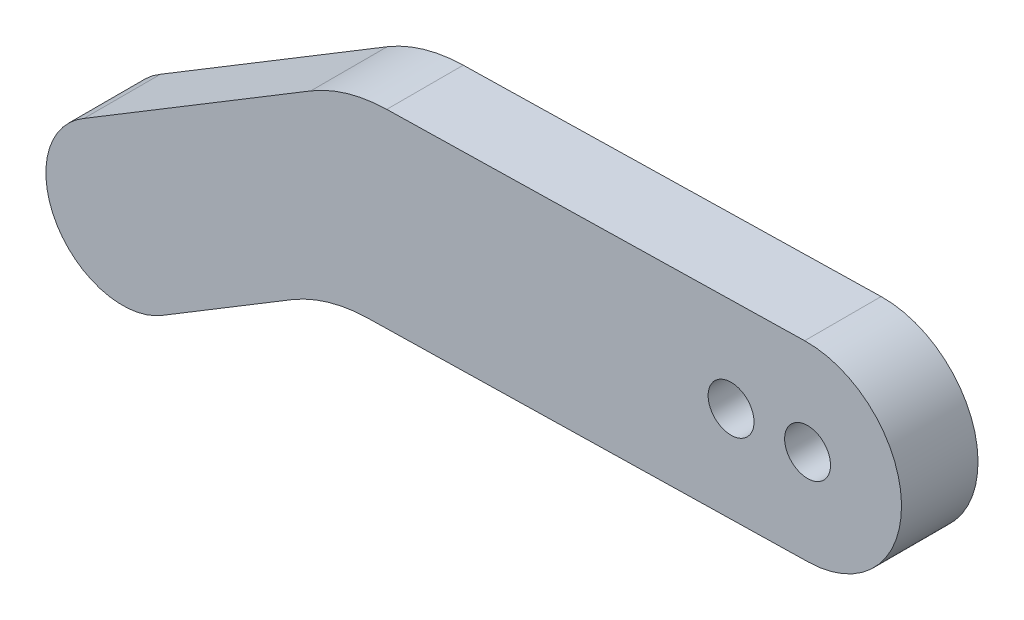
ISO-10303-21;
HEADER;
FILE_DESCRIPTION(('STEP AP214'),'2;1');
FILE_NAME('part.step','',(''),(''),'','','');
FILE_SCHEMA(('AUTOMOTIVE_DESIGN { 1 0 10303 214 1 1 1 1 }'));
ENDSEC;
DATA;
#1=APPLICATION_CONTEXT('core data for automotive mechanical design processes');
#2=APPLICATION_PROTOCOL_DEFINITION('international standard','automotive_design',2000,#1);
#3=PRODUCT_CONTEXT('',#1,'mechanical');
#4=PRODUCT('Part','Part','',(#3));
#5=PRODUCT_RELATED_PRODUCT_CATEGORY('part','',(#4));
#6=PRODUCT_DEFINITION_FORMATION('','',#4);
#7=PRODUCT_DEFINITION_CONTEXT('part definition',#1,'design');
#8=PRODUCT_DEFINITION('design','',#6,#7);
#9=PRODUCT_DEFINITION_SHAPE('','',#8);
#10=(LENGTH_UNIT() NAMED_UNIT(*) SI_UNIT(.MILLI.,.METRE.));
#11=(NAMED_UNIT(*) PLANE_ANGLE_UNIT() SI_UNIT($,.RADIAN.));
#12=(NAMED_UNIT(*) SI_UNIT($,.STERADIAN.) SOLID_ANGLE_UNIT());
#13=UNCERTAINTY_MEASURE_WITH_UNIT(LENGTH_MEASURE(1.E-05),#10,'distance_accuracy_value','');
#14=(GEOMETRIC_REPRESENTATION_CONTEXT(3) GLOBAL_UNCERTAINTY_ASSIGNED_CONTEXT((#13)) GLOBAL_UNIT_ASSIGNED_CONTEXT((#10,
#11,#12)) REPRESENTATION_CONTEXT('',''));
#15=CARTESIAN_POINT('',(0.,0.,0.));
#16=DIRECTION('',(0.,0.,1.));
#17=DIRECTION('',(1.,0.,0.));
#18=AXIS2_PLACEMENT_3D('',#15,#16,#17);
#19=CARTESIAN_POINT('',(5.17664197376865,-8.55583881775578,5.));
#20=DIRECTION('',(-0.517664197376865,0.855583881775578,0.));
#21=DIRECTION('',(-0.855583881775578,-0.517664197376865,0.));
#22=AXIS2_PLACEMENT_3D('',#19,#20,#21);
#23=PLANE('',#22);
#24=DIRECTION('',(0.855583881775578,0.517664197376865,0.));
#25=VECTOR('',#24,1.);
#26=CARTESIAN_POINT('',(5.17664197376865,-8.55583881775578,0.));
#27=LINE('',#26,#25);
#28=CARTESIAN_POINT('',(5.17664197376865,-8.55583881775578,0.));
#29=VERTEX_POINT('',#28);
#30=CARTESIAN_POINT('',(13.5789103941748,-3.47211338692135,0.));
#31=VERTEX_POINT('',#30);
#32=EDGE_CURVE('E132',#29,#31,#27,.T.);
#33=ORIENTED_EDGE('',*,*,#32,.T.);
#34=DIRECTION('',(0.,0.,-1.));
#35=VECTOR('',#34,1.);
#36=CARTESIAN_POINT('',(13.5789103941748,-3.47211338692135,5.));
#37=LINE('',#36,#35);
#38=CARTESIAN_POINT('',(13.5789103941748,-3.47211338692135,5.));
#39=VERTEX_POINT('',#38);
#40=EDGE_CURVE('E11',#39,#31,#37,.T.);
#41=ORIENTED_EDGE('',*,*,#40,.F.);
#42=DIRECTION('',(0.855583881775578,0.517664197376865,0.));
#43=VECTOR('',#42,1.);
#44=CARTESIAN_POINT('',(5.17664197376865,-8.55583881775578,5.));
#45=LINE('',#44,#43);
#46=CARTESIAN_POINT('',(5.17664197376865,-8.55583881775578,5.));
#47=VERTEX_POINT('',#46);
#48=EDGE_CURVE('E151',#47,#39,#45,.T.);
#49=ORIENTED_EDGE('',*,*,#48,.F.);
#50=DIRECTION('',(0.,0.,-1.));
#51=VECTOR('',#50,1.);
#52=CARTESIAN_POINT('',(5.17664197376865,-8.55583881775578,5.));
#53=LINE('',#52,#51);
#54=EDGE_CURVE('E128',#47,#29,#53,.T.);
#55=ORIENTED_EDGE('',*,*,#54,.T.);
#56=EDGE_LOOP('',(#33,#41,#49,#55));
#57=FACE_BOUND('',#56,.T.);
#58=ADVANCED_FACE('F35',(#57),#23,.F.);
#59=CARTESIAN_POINT('',(18.7555523679435,-12.0279522046771,5.));
#60=DIRECTION('',(0.,0.,-1.));
#61=DIRECTION('',(-1.,0.,0.));
#62=AXIS2_PLACEMENT_3D('',#59,#60,#61);
#63=CYLINDRICAL_SURFACE('',#62,10.);
#64=CARTESIAN_POINT('',(18.7555523679435,-12.0279522046771,0.));
#65=DIRECTION('',(0.,0.,1.));
#66=DIRECTION('',(1.,0.,0.));
#67=AXIS2_PLACEMENT_3D('',#64,#65,#66);
#68=CIRCLE('',#67,10.);
#69=CARTESIAN_POINT('',(18.550368321241,-2.03005745093126,0.));
#70=VERTEX_POINT('',#69);
#71=EDGE_CURVE('E135',#31,#70,#68,.F.);
#72=ORIENTED_EDGE('',*,*,#71,.T.);
#73=DIRECTION('',(0.,0.,-1.));
#74=VECTOR('',#73,1.);
#75=CARTESIAN_POINT('',(18.550368321241,-2.03005745093126,5.));
#76=LINE('',#75,#74);
#77=CARTESIAN_POINT('',(18.550368321241,-2.03005745093126,5.));
#78=VERTEX_POINT('',#77);
#79=EDGE_CURVE('E44',#78,#70,#76,.T.);
#80=ORIENTED_EDGE('',*,*,#79,.F.);
#81=CARTESIAN_POINT('',(18.7555523679435,-12.0279522046771,5.));
#82=DIRECTION('',(0.,0.,1.));
#83=DIRECTION('',(1.,0.,0.));
#84=AXIS2_PLACEMENT_3D('',#81,#82,#83);
#85=CIRCLE('',#84,10.);
#86=EDGE_CURVE('E92',#39,#78,#85,.F.);
#87=ORIENTED_EDGE('',*,*,#86,.F.);
#88=ORIENTED_EDGE('',*,*,#40,.T.);
#89=EDGE_LOOP('',(#72,#80,#87,#88));
#90=FACE_BOUND('',#89,.T.);
#91=ADVANCED_FACE('F201',(#90),#63,.F.);
#92=CARTESIAN_POINT('',(0.0494545677066128,-2.4097466200159,5.));
#93=DIRECTION('',(-0.0205184046702574,0.999789475374585,0.));
#94=DIRECTION('',(-0.999789475374585,-0.0205184046702574,0.));
#95=AXIS2_PLACEMENT_3D('',#92,#93,#94);
#96=PLANE('',#95);
#97=DIRECTION('',(0.999789475374585,0.0205184046702574,0.));
#98=VECTOR('',#97,1.);
#99=CARTESIAN_POINT('',(0.0494545677066128,-2.4097466200159,0.));
#100=LINE('',#99,#98);
#101=CARTESIAN_POINT('',(47.3600005111583,-1.43880528611674,0.));
#102=VERTEX_POINT('',#101);
#103=EDGE_CURVE('E138',#70,#102,#100,.T.);
#104=ORIENTED_EDGE('',*,*,#103,.T.);
#105=DIRECTION('',(0.,0.,-1.));
#106=VECTOR('',#105,1.);
#107=CARTESIAN_POINT('',(47.3600005111583,-1.43880528611674,5.));
#108=LINE('',#107,#106);
#109=CARTESIAN_POINT('',(47.3600005111583,-1.43880528611674,5.));
#110=VERTEX_POINT('',#109);
#111=EDGE_CURVE('E157',#110,#102,#108,.T.);
#112=ORIENTED_EDGE('',*,*,#111,.F.);
#113=DIRECTION('',(0.999789475374585,0.0205184046702574,0.));
#114=VECTOR('',#113,1.);
#115=CARTESIAN_POINT('',(0.0494545677066128,-2.4097466200159,5.));
#116=LINE('',#115,#114);
#117=EDGE_CURVE('E174',#78,#110,#116,.T.);
#118=ORIENTED_EDGE('',*,*,#117,.F.);
#119=ORIENTED_EDGE('',*,*,#79,.T.);
#120=EDGE_LOOP('',(#104,#112,#118,#119));
#121=FACE_BOUND('',#120,.T.);
#122=ADVANCED_FACE('F205',(#121),#96,.F.);
#123=CARTESIAN_POINT('',(47.2326812039537,4.76501540076415,5.));
#124=DIRECTION('',(0.,0.,-1.));
#125=DIRECTION('',(-1.,0.,0.));
#126=AXIS2_PLACEMENT_3D('',#123,#124,#125);
#127=CYLINDRICAL_SURFACE('',#126,6.20512701892219);
#128=CARTESIAN_POINT('',(47.2326812039537,4.76501540076415,0.));
#129=DIRECTION('',(0.,0.,1.));
#130=DIRECTION('',(1.,0.,0.));
#131=AXIS2_PLACEMENT_3D('',#128,#129,#130);
#132=CIRCLE('',#131,6.20512701892219);
#133=CARTESIAN_POINT('',(47.1053618967491,10.968836087645,0.));
#134=VERTEX_POINT('',#133);
#135=EDGE_CURVE('E141',#134,#102,#132,.F.);
#136=ORIENTED_EDGE('',*,*,#135,.F.);
#137=DIRECTION('',(0.,0.,-1.));
#138=VECTOR('',#137,1.);
#139=CARTESIAN_POINT('',(47.1053618967491,10.968836087645,5.));
#140=LINE('',#139,#138);
#141=CARTESIAN_POINT('',(47.1053618967491,10.968836087645,5.));
#142=VERTEX_POINT('',#141);
#143=EDGE_CURVE('E155',#142,#134,#140,.T.);
#144=ORIENTED_EDGE('',*,*,#143,.F.);
#145=CARTESIAN_POINT('',(47.2326812039537,4.76501540076415,5.));
#146=DIRECTION('',(0.,0.,1.));
#147=DIRECTION('',(1.,0.,0.));
#148=AXIS2_PLACEMENT_3D('',#145,#146,#147);
#149=CIRCLE('',#148,6.20512701892219);
#150=EDGE_CURVE('E176',#142,#110,#149,.F.);
#151=ORIENTED_EDGE('',*,*,#150,.T.);
#152=ORIENTED_EDGE('',*,*,#111,.T.);
#153=EDGE_LOOP('',(#136,#144,#151,#152));
#154=FACE_BOUND('',#153,.T.);
#155=ADVANCED_FACE('F209',(#154),#127,.T.);
#156=CARTESIAN_POINT('',(-0.205184046702573,9.99789475374587,5.));
#157=DIRECTION('',(-0.0205184046702572,0.999789475374585,0.));
#158=DIRECTION('',(-0.999789475374585,-0.0205184046702572,0.));
#159=AXIS2_PLACEMENT_3D('',#156,#157,#158);
#160=PLANE('',#159);
#161=DIRECTION('',(0.999789475374585,0.0205184046702572,0.));
#162=VECTOR('',#161,1.);
#163=CARTESIAN_POINT('',(-0.205184046702573,9.99789475374587,0.));
#164=LINE('',#163,#162);
#165=CARTESIAN_POINT('',(19.7906054607892,10.408262847151,0.));
#166=VERTEX_POINT('',#165);
#167=EDGE_CURVE('E144',#166,#134,#164,.T.);
#168=ORIENTED_EDGE('',*,*,#167,.F.);
#169=DIRECTION('',(0.,0.,-1.));
#170=VECTOR('',#169,1.);
#171=CARTESIAN_POINT('',(19.7906054607892,10.408262847151,5.));
#172=LINE('',#171,#170);
#173=CARTESIAN_POINT('',(19.7906054607892,10.408262847151,5.));
#174=VERTEX_POINT('',#173);
#175=EDGE_CURVE('E117',#174,#166,#172,.T.);
#176=ORIENTED_EDGE('',*,*,#175,.F.);
#177=DIRECTION('',(0.999789475374585,0.0205184046702572,0.));
#178=VECTOR('',#177,1.);
#179=CARTESIAN_POINT('',(-0.205184046702573,9.99789475374587,5.));
#180=LINE('',#179,#178);
#181=EDGE_CURVE('E124',#174,#142,#180,.T.);
#182=ORIENTED_EDGE('',*,*,#181,.T.);
#183=ORIENTED_EDGE('',*,*,#143,.T.);
#184=EDGE_LOOP('',(#168,#176,#182,#183));
#185=FACE_BOUND('',#184,.T.);
#186=ADVANCED_FACE('F180',(#185),#160,.T.);
#187=CARTESIAN_POINT('',(19.9957895074917,0.410368093405163,5.));
#188=DIRECTION('',(0.,0.,-1.));
#189=DIRECTION('',(-1.,0.,0.));
#190=AXIS2_PLACEMENT_3D('',#187,#188,#189);
#191=CYLINDRICAL_SURFACE('',#190,10.);
#192=CARTESIAN_POINT('',(19.9957895074917,0.410368093405163,0.));
#193=DIRECTION('',(0.,0.,1.));
#194=DIRECTION('',(1.,0.,0.));
#195=AXIS2_PLACEMENT_3D('',#192,#193,#194);
#196=CIRCLE('',#195,10.);
#197=CARTESIAN_POINT('',(14.819147533723,8.96620691116092,0.));
#198=VERTEX_POINT('',#197);
#199=EDGE_CURVE('E112',#198,#166,#196,.F.);
#200=ORIENTED_EDGE('',*,*,#199,.F.);
#201=DIRECTION('',(0.,0.,-1.));
#202=VECTOR('',#201,1.);
#203=CARTESIAN_POINT('',(14.819147533723,8.96620691116092,5.));
#204=LINE('',#203,#202);
#205=CARTESIAN_POINT('',(14.819147533723,8.96620691116092,5.));
#206=VERTEX_POINT('',#205);
#207=EDGE_CURVE('E107',#206,#198,#204,.T.);
#208=ORIENTED_EDGE('',*,*,#207,.F.);
#209=CARTESIAN_POINT('',(19.9957895074917,0.410368093405163,5.));
#210=DIRECTION('',(0.,0.,1.));
#211=DIRECTION('',(1.,0.,0.));
#212=AXIS2_PLACEMENT_3D('',#209,#210,#211);
#213=CIRCLE('',#212,10.);
#214=EDGE_CURVE('E110',#206,#174,#213,.F.);
#215=ORIENTED_EDGE('',*,*,#214,.T.);
#216=ORIENTED_EDGE('',*,*,#175,.T.);
#217=EDGE_LOOP('',(#200,#208,#215,#216));
#218=FACE_BOUND('',#217,.T.);
#219=ADVANCED_FACE('F109',(#218),#191,.T.);
#220=CARTESIAN_POINT('',(0.,0.,5.));
#221=DIRECTION('',(-0.517664197376866,0.855583881775578,0.));
#222=DIRECTION('',(-0.855583881775578,-0.517664197376866,0.));
#223=AXIS2_PLACEMENT_3D('',#220,#221,#222);
#224=PLANE('',#223);
#225=DIRECTION('',(0.855583881775578,0.517664197376866,0.));
#226=VECTOR('',#225,1.);
#227=CARTESIAN_POINT('',(0.,0.,0.));
#228=LINE('',#227,#226);
#229=CARTESIAN_POINT('',(0.,0.,0.));
#230=VERTEX_POINT('',#229);
#231=EDGE_CURVE('E148',#230,#198,#228,.T.);
#232=ORIENTED_EDGE('',*,*,#231,.F.);
#233=DIRECTION('',(0.,0.,-1.));
#234=VECTOR('',#233,1.);
#235=CARTESIAN_POINT('',(0.,0.,5.));
#236=LINE('',#235,#234);
#237=CARTESIAN_POINT('',(0.,0.,5.));
#238=VERTEX_POINT('',#237);
#239=EDGE_CURVE('E81',#238,#230,#236,.T.);
#240=ORIENTED_EDGE('',*,*,#239,.F.);
#241=DIRECTION('',(0.855583881775578,0.517664197376866,0.));
#242=VECTOR('',#241,1.);
#243=CARTESIAN_POINT('',(0.,0.,5.));
#244=LINE('',#243,#242);
#245=EDGE_CURVE('E121',#238,#206,#244,.T.);
#246=ORIENTED_EDGE('',*,*,#245,.T.);
#247=ORIENTED_EDGE('',*,*,#207,.T.);
#248=EDGE_LOOP('',(#232,#240,#246,#247));
#249=FACE_BOUND('',#248,.T.);
#250=ADVANCED_FACE('F126',(#249),#224,.T.);
#251=CARTESIAN_POINT('',(2.51153578820938,-4.32437768034508,5.));
#252=DIRECTION('',(0.,0.,-1.));
#253=DIRECTION('',(-1.,0.,0.));
#254=AXIS2_PLACEMENT_3D('',#251,#252,#253);
#255=CYLINDRICAL_SURFACE('',#254,5.00080536891042);
#256=CARTESIAN_POINT('',(2.51153578820938,-4.32437768034508,0.));
#257=DIRECTION('',(0.,0.,1.));
#258=DIRECTION('',(1.,0.,0.));
#259=AXIS2_PLACEMENT_3D('',#256,#257,#258);
#260=CIRCLE('',#259,5.00080536891042);
#261=EDGE_CURVE('E84',#230,#29,#260,.T.);
#262=ORIENTED_EDGE('',*,*,#261,.T.);
#263=ORIENTED_EDGE('',*,*,#54,.F.);
#264=CARTESIAN_POINT('',(2.51153578820938,-4.32437768034508,5.));
#265=DIRECTION('',(0.,0.,1.));
#266=DIRECTION('',(1.,0.,0.));
#267=AXIS2_PLACEMENT_3D('',#264,#265,#266);
#268=CIRCLE('',#267,5.00080536891042);
#269=EDGE_CURVE('E53',#238,#47,#268,.T.);
#270=ORIENTED_EDGE('',*,*,#269,.F.);
#271=ORIENTED_EDGE('',*,*,#239,.T.);
#272=EDGE_LOOP('',(#262,#263,#270,#271));
#273=FACE_BOUND('',#272,.T.);
#274=ADVANCED_FACE('F189',(#273),#255,.T.);
#275=CARTESIAN_POINT('',(0.,0.,5.));
#276=DIRECTION('',(0.,0.,1.));
#277=DIRECTION('',(1.,0.,0.));
#278=AXIS2_PLACEMENT_3D('',#275,#276,#277);
#279=PLANE('',#278);
#280=CARTESIAN_POINT('',(42.296340857556,4.7143671550039,5.));
#281=DIRECTION('',(0.,0.,1.));
#282=DIRECTION('',(1.,0.,0.));
#283=AXIS2_PLACEMENT_3D('',#280,#281,#282);
#284=CIRCLE('',#283,1.5);
#285=CARTESIAN_POINT('',(43.796340857556,4.7143671550039,5.));
#286=VERTEX_POINT('',#285);
#287=EDGE_CURVE('E169',#286,#286,#284,.T.);
#288=ORIENTED_EDGE('',*,*,#287,.F.);
#289=EDGE_LOOP('',(#288));
#290=FACE_BOUND('',#289,.T.);
#291=CARTESIAN_POINT('',(47.296340857556,4.7656685667848,5.));
#292=DIRECTION('',(0.,0.,1.));
#293=DIRECTION('',(1.,0.,0.));
#294=AXIS2_PLACEMENT_3D('',#291,#292,#293);
#295=CIRCLE('',#294,1.5);
#296=CARTESIAN_POINT('',(48.796340857556,4.7656685667848,5.));
#297=VERTEX_POINT('',#296);
#298=EDGE_CURVE('E161',#297,#297,#295,.T.);
#299=ORIENTED_EDGE('',*,*,#298,.F.);
#300=EDGE_LOOP('',(#299));
#301=FACE_BOUND('',#300,.T.);
#302=ORIENTED_EDGE('',*,*,#48,.T.);
#303=ORIENTED_EDGE('',*,*,#86,.T.);
#304=ORIENTED_EDGE('',*,*,#117,.T.);
#305=ORIENTED_EDGE('',*,*,#150,.F.);
#306=ORIENTED_EDGE('',*,*,#181,.F.);
#307=ORIENTED_EDGE('',*,*,#214,.F.);
#308=ORIENTED_EDGE('',*,*,#245,.F.);
#309=ORIENTED_EDGE('',*,*,#269,.T.);
#310=EDGE_LOOP('',(#302,#303,#304,#305,#306,#307,#308,#309));
#311=FACE_BOUND('',#310,.T.);
#312=ADVANCED_FACE('F120',(#290,#301,#311),#279,.T.);
#313=CARTESIAN_POINT('',(0.,0.,0.));
#314=DIRECTION('',(0.,0.,1.));
#315=DIRECTION('',(1.,0.,0.));
#316=AXIS2_PLACEMENT_3D('',#313,#314,#315);
#317=PLANE('',#316);
#318=CARTESIAN_POINT('',(42.296340857556,4.7143671550039,0.));
#319=DIRECTION('',(0.,0.,1.));
#320=DIRECTION('',(1.,0.,0.));
#321=AXIS2_PLACEMENT_3D('',#318,#319,#320);
#322=CIRCLE('',#321,1.5);
#323=CARTESIAN_POINT('',(43.796340857556,4.7143671550039,0.));
#324=VERTEX_POINT('',#323);
#325=EDGE_CURVE('E38',#324,#324,#322,.T.);
#326=ORIENTED_EDGE('',*,*,#325,.T.);
#327=EDGE_LOOP('',(#326));
#328=FACE_BOUND('',#327,.T.);
#329=CARTESIAN_POINT('',(47.296340857556,4.7656685667848,0.));
#330=DIRECTION('',(0.,0.,1.));
#331=DIRECTION('',(1.,0.,0.));
#332=AXIS2_PLACEMENT_3D('',#329,#330,#331);
#333=CIRCLE('',#332,1.5);
#334=CARTESIAN_POINT('',(48.796340857556,4.7656685667848,0.));
#335=VERTEX_POINT('',#334);
#336=EDGE_CURVE('E136',#335,#335,#333,.T.);
#337=ORIENTED_EDGE('',*,*,#336,.T.);
#338=EDGE_LOOP('',(#337));
#339=FACE_BOUND('',#338,.T.);
#340=ORIENTED_EDGE('',*,*,#32,.F.);
#341=ORIENTED_EDGE('',*,*,#261,.F.);
#342=ORIENTED_EDGE('',*,*,#231,.T.);
#343=ORIENTED_EDGE('',*,*,#199,.T.);
#344=ORIENTED_EDGE('',*,*,#167,.T.);
#345=ORIENTED_EDGE('',*,*,#135,.T.);
#346=ORIENTED_EDGE('',*,*,#103,.F.);
#347=ORIENTED_EDGE('',*,*,#71,.F.);
#348=EDGE_LOOP('',(#340,#341,#342,#343,#344,#345,#346,#347));
#349=FACE_BOUND('',#348,.T.);
#350=ADVANCED_FACE('F184',(#328,#339,#349),#317,.F.);
#351=CARTESIAN_POINT('',(47.296340857556,4.7656685667848,-2.));
#352=DIRECTION('',(0.,0.,1.));
#353=DIRECTION('',(1.,0.,0.));
#354=AXIS2_PLACEMENT_3D('',#351,#352,#353);
#355=CYLINDRICAL_SURFACE('',#354,1.5);
#356=ORIENTED_EDGE('',*,*,#298,.T.);
#357=EDGE_LOOP('',(#356));
#358=FACE_BOUND('',#357,.T.);
#359=ORIENTED_EDGE('',*,*,#336,.F.);
#360=EDGE_LOOP('',(#359));
#361=FACE_BOUND('',#360,.T.);
#362=ADVANCED_FACE('F246',(#358,#361),#355,.F.);
#363=CARTESIAN_POINT('',(42.296340857556,4.7143671550039,-2.));
#364=DIRECTION('',(0.,0.,1.));
#365=DIRECTION('',(1.,0.,0.));
#366=AXIS2_PLACEMENT_3D('',#363,#364,#365);
#367=CYLINDRICAL_SURFACE('',#366,1.5);
#368=ORIENTED_EDGE('',*,*,#287,.T.);
#369=EDGE_LOOP('',(#368));
#370=FACE_BOUND('',#369,.T.);
#371=ORIENTED_EDGE('',*,*,#325,.F.);
#372=EDGE_LOOP('',(#371));
#373=FACE_BOUND('',#372,.T.);
#374=ADVANCED_FACE('F255',(#370,#373),#367,.F.);
#375=CLOSED_SHELL('',(#58,#91,#122,#155,#186,#219,#250,#274,#312,#350,#362,#374));
#376=MANIFOLD_SOLID_BREP('B2',#375);
#377=ADVANCED_BREP_SHAPE_REPRESENTATION('',(#18,#376),#14);
#378=SHAPE_DEFINITION_REPRESENTATION(#9,#377);
ENDSEC;
END-ISO-10303-21;
